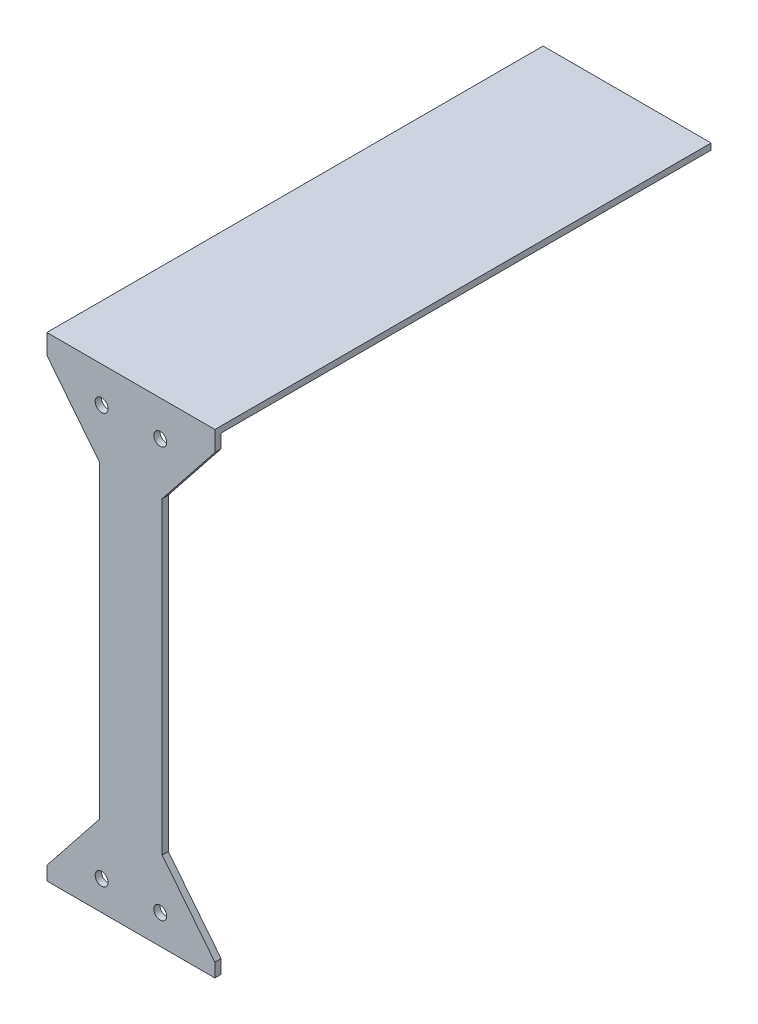
ISO-10303-21;
HEADER;
FILE_DESCRIPTION(('STEP AP214'),'2;1');
FILE_NAME('part.step','',(''),(''),'','','');
FILE_SCHEMA(('AUTOMOTIVE_DESIGN { 1 0 10303 214 1 1 1 1 }'));
ENDSEC;
DATA;
#1=APPLICATION_CONTEXT('core data for automotive mechanical design processes');
#2=APPLICATION_PROTOCOL_DEFINITION('international standard','automotive_design',2000,#1);
#3=PRODUCT_CONTEXT('',#1,'mechanical');
#4=PRODUCT('Part','Part','',(#3));
#5=PRODUCT_RELATED_PRODUCT_CATEGORY('part','',(#4));
#6=PRODUCT_DEFINITION_FORMATION('','',#4);
#7=PRODUCT_DEFINITION_CONTEXT('part definition',#1,'design');
#8=PRODUCT_DEFINITION('design','',#6,#7);
#9=PRODUCT_DEFINITION_SHAPE('','',#8);
#10=(LENGTH_UNIT() NAMED_UNIT(*) SI_UNIT(.MILLI.,.METRE.));
#11=(NAMED_UNIT(*) PLANE_ANGLE_UNIT() SI_UNIT($,.RADIAN.));
#12=(NAMED_UNIT(*) SI_UNIT($,.STERADIAN.) SOLID_ANGLE_UNIT());
#13=UNCERTAINTY_MEASURE_WITH_UNIT(LENGTH_MEASURE(1.E-05),#10,'distance_accuracy_value','');
#14=(GEOMETRIC_REPRESENTATION_CONTEXT(3) GLOBAL_UNCERTAINTY_ASSIGNED_CONTEXT((#13)) GLOBAL_UNIT_ASSIGNED_CONTEXT((#10,
#11,#12)) REPRESENTATION_CONTEXT('',''));
#15=CARTESIAN_POINT('',(0.,0.,0.));
#16=DIRECTION('',(0.,0.,1.));
#17=DIRECTION('',(1.,0.,0.));
#18=AXIS2_PLACEMENT_3D('',#15,#16,#17);
#19=CARTESIAN_POINT('',(0.,0.,1.5875));
#20=DIRECTION('',(0.,0.,-1.));
#21=DIRECTION('',(-1.,0.,0.));
#22=AXIS2_PLACEMENT_3D('',#19,#20,#21);
#23=PLANE('',#22);
#24=DIRECTION('',(0.,1.,0.));
#25=VECTOR('',#24,1.);
#26=CARTESIAN_POINT('',(-117.,20.5,1.5875));
#27=LINE('',#26,#25);
#28=CARTESIAN_POINT('',(-117.,20.5,1.5875));
#29=VERTEX_POINT('',#28);
#30=CARTESIAN_POINT('',(-117.,99.5,1.5875));
#31=VERTEX_POINT('',#30);
#32=EDGE_CURVE('E180',#29,#31,#27,.T.);
#33=ORIENTED_EDGE('',*,*,#32,.T.);
#34=DIRECTION('',(0.621882143601587,0.783110847498294,0.));
#35=VECTOR('',#34,1.);
#36=CARTESIAN_POINT('',(-117.,99.5,1.5875));
#37=LINE('',#36,#35);
#38=CARTESIAN_POINT('',(-103.5,116.5,1.5875));
#39=VERTEX_POINT('',#38);
#40=EDGE_CURVE('E111',#31,#39,#37,.T.);
#41=ORIENTED_EDGE('',*,*,#40,.T.);
#42=DIRECTION('',(0.,1.,0.));
#43=VECTOR('',#42,1.);
#44=CARTESIAN_POINT('',(-103.5,116.5,1.5875));
#45=LINE('',#44,#43);
#46=CARTESIAN_POINT('',(-103.5,121.5875,1.5875));
#47=VERTEX_POINT('',#46);
#48=EDGE_CURVE('E204',#39,#47,#45,.T.);
#49=ORIENTED_EDGE('',*,*,#48,.T.);
#50=DIRECTION('',(1.,0.,0.));
#51=VECTOR('',#50,1.);
#52=CARTESIAN_POINT('',(-146.5,121.5875,1.5875));
#53=LINE('',#52,#51);
#54=CARTESIAN_POINT('',(-146.5,121.5875,1.5875));
#55=VERTEX_POINT('',#54);
#56=EDGE_CURVE('E231',#55,#47,#53,.T.);
#57=ORIENTED_EDGE('',*,*,#56,.F.);
#58=DIRECTION('',(0.,-1.,0.));
#59=VECTOR('',#58,1.);
#60=CARTESIAN_POINT('',(-146.5,116.5,1.5875));
#61=LINE('',#60,#59);
#62=CARTESIAN_POINT('',(-146.5,116.5,1.5875));
#63=VERTEX_POINT('',#62);
#64=EDGE_CURVE('E263',#55,#63,#61,.T.);
#65=ORIENTED_EDGE('',*,*,#64,.T.);
#66=DIRECTION('',(0.621882143601586,-0.783110847498294,0.));
#67=VECTOR('',#66,1.);
#68=CARTESIAN_POINT('',(-146.5,116.5,1.5875));
#69=LINE('',#68,#67);
#70=CARTESIAN_POINT('',(-133.,99.5,1.5875));
#71=VERTEX_POINT('',#70);
#72=EDGE_CURVE('E265',#63,#71,#69,.T.);
#73=ORIENTED_EDGE('',*,*,#72,.T.);
#74=DIRECTION('',(0.,-1.,0.));
#75=VECTOR('',#74,1.);
#76=CARTESIAN_POINT('',(-133.,99.5,1.5875));
#77=LINE('',#76,#75);
#78=CARTESIAN_POINT('',(-133.,20.5,1.5875));
#79=VERTEX_POINT('',#78);
#80=EDGE_CURVE('E267',#71,#79,#77,.T.);
#81=ORIENTED_EDGE('',*,*,#80,.T.);
#82=DIRECTION('',(-0.621882143601586,-0.783110847498294,0.));
#83=VECTOR('',#82,1.);
#84=CARTESIAN_POINT('',(-133.,20.5,1.5875));
#85=LINE('',#84,#83);
#86=CARTESIAN_POINT('',(-146.5,3.5,1.5875));
#87=VERTEX_POINT('',#86);
#88=EDGE_CURVE('E269',#79,#87,#85,.T.);
#89=ORIENTED_EDGE('',*,*,#88,.T.);
#90=DIRECTION('',(0.,-1.,0.));
#91=VECTOR('',#90,1.);
#92=CARTESIAN_POINT('',(-146.5,3.5,1.5875));
#93=LINE('',#92,#91);
#94=CARTESIAN_POINT('',(-146.5,0.,1.5875));
#95=VERTEX_POINT('',#94);
#96=EDGE_CURVE('E138',#87,#95,#93,.T.);
#97=ORIENTED_EDGE('',*,*,#96,.T.);
#98=DIRECTION('',(1.,0.,0.));
#99=VECTOR('',#98,1.);
#100=CARTESIAN_POINT('',(-103.5,0.,1.5875));
#101=LINE('',#100,#99);
#102=CARTESIAN_POINT('',(-103.5,0.,1.5875));
#103=VERTEX_POINT('',#102);
#104=EDGE_CURVE('E132',#95,#103,#101,.T.);
#105=ORIENTED_EDGE('',*,*,#104,.T.);
#106=DIRECTION('',(0.,1.,0.));
#107=VECTOR('',#106,1.);
#108=CARTESIAN_POINT('',(-103.5,3.5,1.5875));
#109=LINE('',#108,#107);
#110=CARTESIAN_POINT('',(-103.5,3.5,1.5875));
#111=VERTEX_POINT('',#110);
#112=EDGE_CURVE('E136',#103,#111,#109,.T.);
#113=ORIENTED_EDGE('',*,*,#112,.T.);
#114=DIRECTION('',(-0.621882143601587,0.783110847498294,0.));
#115=VECTOR('',#114,1.);
#116=CARTESIAN_POINT('',(-103.5,3.5,1.5875));
#117=LINE('',#116,#115);
#118=EDGE_CURVE('E58',#111,#29,#117,.T.);
#119=ORIENTED_EDGE('',*,*,#118,.T.);
#120=EDGE_LOOP('',(#33,#41,#49,#57,#65,#73,#81,#89,#97,#105,#113,#119));
#121=FACE_BOUND('',#120,.T.);
#122=CARTESIAN_POINT('',(-132.5,112.5,1.5875));
#123=DIRECTION('',(0.,0.,1.));
#124=DIRECTION('',(1.,0.,0.));
#125=AXIS2_PLACEMENT_3D('',#122,#123,#124);
#126=CIRCLE('',#125,1.65);
#127=CARTESIAN_POINT('',(-130.85,112.5,1.5875));
#128=VERTEX_POINT('',#127);
#129=EDGE_CURVE('E160',#128,#128,#126,.T.);
#130=ORIENTED_EDGE('',*,*,#129,.F.);
#131=EDGE_LOOP('',(#130));
#132=FACE_BOUND('',#131,.T.);
#133=CARTESIAN_POINT('',(-117.5,112.5,1.5875));
#134=DIRECTION('',(0.,0.,1.));
#135=DIRECTION('',(1.,0.,0.));
#136=AXIS2_PLACEMENT_3D('',#133,#134,#135);
#137=CIRCLE('',#136,1.65000000000001);
#138=CARTESIAN_POINT('',(-115.85,112.5,1.5875));
#139=VERTEX_POINT('',#138);
#140=EDGE_CURVE('E250',#139,#139,#137,.T.);
#141=ORIENTED_EDGE('',*,*,#140,.F.);
#142=EDGE_LOOP('',(#141));
#143=FACE_BOUND('',#142,.T.);
#144=CARTESIAN_POINT('',(-117.5,7.5,1.5875));
#145=DIRECTION('',(0.,0.,1.));
#146=DIRECTION('',(1.,0.,0.));
#147=AXIS2_PLACEMENT_3D('',#144,#145,#146);
#148=CIRCLE('',#147,1.65000000000001);
#149=CARTESIAN_POINT('',(-115.85,7.5,1.5875));
#150=VERTEX_POINT('',#149);
#151=EDGE_CURVE('E244',#150,#150,#148,.T.);
#152=ORIENTED_EDGE('',*,*,#151,.F.);
#153=EDGE_LOOP('',(#152));
#154=FACE_BOUND('',#153,.T.);
#155=CARTESIAN_POINT('',(-132.5,7.5,1.5875));
#156=DIRECTION('',(0.,0.,1.));
#157=DIRECTION('',(1.,0.,0.));
#158=AXIS2_PLACEMENT_3D('',#155,#156,#157);
#159=CIRCLE('',#158,1.65);
#160=CARTESIAN_POINT('',(-130.85,7.5,1.5875));
#161=VERTEX_POINT('',#160);
#162=EDGE_CURVE('E238',#161,#161,#159,.T.);
#163=ORIENTED_EDGE('',*,*,#162,.F.);
#164=EDGE_LOOP('',(#163));
#165=FACE_BOUND('',#164,.T.);
#166=ADVANCED_FACE('F41',(#121,#132,#143,#154,#165),#23,.F.);
#167=CARTESIAN_POINT('',(0.,0.,0.));
#168=DIRECTION('',(0.,0.,-1.));
#169=DIRECTION('',(-1.,0.,0.));
#170=AXIS2_PLACEMENT_3D('',#167,#168,#169);
#171=PLANE('',#170);
#172=CARTESIAN_POINT('',(-117.5,7.5,0.));
#173=DIRECTION('',(0.,0.,1.));
#174=DIRECTION('',(1.,0.,0.));
#175=AXIS2_PLACEMENT_3D('',#172,#173,#174);
#176=CIRCLE('',#175,1.65000000000001);
#177=CARTESIAN_POINT('',(-115.85,7.5,0.));
#178=VERTEX_POINT('',#177);
#179=EDGE_CURVE('E241',#178,#178,#176,.T.);
#180=ORIENTED_EDGE('',*,*,#179,.T.);
#181=EDGE_LOOP('',(#180));
#182=FACE_BOUND('',#181,.T.);
#183=CARTESIAN_POINT('',(-132.5,112.5,0.));
#184=DIRECTION('',(0.,0.,1.));
#185=DIRECTION('',(1.,0.,0.));
#186=AXIS2_PLACEMENT_3D('',#183,#184,#185);
#187=CIRCLE('',#186,1.65);
#188=CARTESIAN_POINT('',(-130.85,112.5,0.));
#189=VERTEX_POINT('',#188);
#190=EDGE_CURVE('E253',#189,#189,#187,.T.);
#191=ORIENTED_EDGE('',*,*,#190,.T.);
#192=EDGE_LOOP('',(#191));
#193=FACE_BOUND('',#192,.T.);
#194=DIRECTION('',(0.,1.,0.));
#195=VECTOR('',#194,1.);
#196=CARTESIAN_POINT('',(-117.,20.5,0.));
#197=LINE('',#196,#195);
#198=CARTESIAN_POINT('',(-117.,20.5,0.));
#199=VERTEX_POINT('',#198);
#200=CARTESIAN_POINT('',(-117.,99.5,0.));
#201=VERTEX_POINT('',#200);
#202=EDGE_CURVE('E156',#199,#201,#197,.T.);
#203=ORIENTED_EDGE('',*,*,#202,.F.);
#204=DIRECTION('',(-0.621882143601587,0.783110847498294,0.));
#205=VECTOR('',#204,1.);
#206=CARTESIAN_POINT('',(-103.5,3.5,0.));
#207=LINE('',#206,#205);
#208=CARTESIAN_POINT('',(-103.5,3.5,0.));
#209=VERTEX_POINT('',#208);
#210=EDGE_CURVE('E103',#209,#199,#207,.T.);
#211=ORIENTED_EDGE('',*,*,#210,.F.);
#212=DIRECTION('',(0.,1.,0.));
#213=VECTOR('',#212,1.);
#214=CARTESIAN_POINT('',(-103.5,3.5,0.));
#215=LINE('',#214,#213);
#216=CARTESIAN_POINT('',(-103.5,0.,0.));
#217=VERTEX_POINT('',#216);
#218=EDGE_CURVE('E97',#217,#209,#215,.T.);
#219=ORIENTED_EDGE('',*,*,#218,.F.);
#220=DIRECTION('',(1.,0.,0.));
#221=VECTOR('',#220,1.);
#222=CARTESIAN_POINT('',(-103.5,0.,0.));
#223=LINE('',#222,#221);
#224=CARTESIAN_POINT('',(-146.5,0.,0.));
#225=VERTEX_POINT('',#224);
#226=EDGE_CURVE('E146',#225,#217,#223,.T.);
#227=ORIENTED_EDGE('',*,*,#226,.F.);
#228=DIRECTION('',(0.,-1.,0.));
#229=VECTOR('',#228,1.);
#230=CARTESIAN_POINT('',(-146.5,3.5,0.));
#231=LINE('',#230,#229);
#232=CARTESIAN_POINT('',(-146.5,3.5,0.));
#233=VERTEX_POINT('',#232);
#234=EDGE_CURVE('E175',#233,#225,#231,.T.);
#235=ORIENTED_EDGE('',*,*,#234,.F.);
#236=DIRECTION('',(-0.621882143601586,-0.783110847498294,0.));
#237=VECTOR('',#236,1.);
#238=CARTESIAN_POINT('',(-133.,20.5,0.));
#239=LINE('',#238,#237);
#240=CARTESIAN_POINT('',(-133.,20.5,0.));
#241=VERTEX_POINT('',#240);
#242=EDGE_CURVE('E173',#241,#233,#239,.T.);
#243=ORIENTED_EDGE('',*,*,#242,.F.);
#244=DIRECTION('',(0.,-1.,0.));
#245=VECTOR('',#244,1.);
#246=CARTESIAN_POINT('',(-133.,99.5,0.));
#247=LINE('',#246,#245);
#248=CARTESIAN_POINT('',(-133.,99.5,0.));
#249=VERTEX_POINT('',#248);
#250=EDGE_CURVE('E171',#249,#241,#247,.T.);
#251=ORIENTED_EDGE('',*,*,#250,.F.);
#252=DIRECTION('',(0.621882143601586,-0.783110847498294,0.));
#253=VECTOR('',#252,1.);
#254=CARTESIAN_POINT('',(-146.5,116.5,0.));
#255=LINE('',#254,#253);
#256=CARTESIAN_POINT('',(-146.5,116.5,0.));
#257=VERTEX_POINT('',#256);
#258=EDGE_CURVE('E169',#257,#249,#255,.T.);
#259=ORIENTED_EDGE('',*,*,#258,.F.);
#260=DIRECTION('',(0.,-1.,0.));
#261=VECTOR('',#260,1.);
#262=CARTESIAN_POINT('',(-146.5,116.5,0.));
#263=LINE('',#262,#261);
#264=CARTESIAN_POINT('',(-146.5,120.,0.));
#265=VERTEX_POINT('',#264);
#266=EDGE_CURVE('E167',#265,#257,#263,.T.);
#267=ORIENTED_EDGE('',*,*,#266,.F.);
#268=DIRECTION('',(-1.,0.,0.));
#269=VECTOR('',#268,1.);
#270=CARTESIAN_POINT('',(-146.5,120.,0.));
#271=LINE('',#270,#269);
#272=CARTESIAN_POINT('',(-103.5,120.,0.));
#273=VERTEX_POINT('',#272);
#274=EDGE_CURVE('E164',#273,#265,#271,.T.);
#275=ORIENTED_EDGE('',*,*,#274,.F.);
#276=DIRECTION('',(0.,1.,0.));
#277=VECTOR('',#276,1.);
#278=CARTESIAN_POINT('',(-103.5,116.5,0.));
#279=LINE('',#278,#277);
#280=CARTESIAN_POINT('',(-103.5,116.5,0.));
#281=VERTEX_POINT('',#280);
#282=EDGE_CURVE('E162',#281,#273,#279,.T.);
#283=ORIENTED_EDGE('',*,*,#282,.F.);
#284=DIRECTION('',(0.621882143601587,0.783110847498294,0.));
#285=VECTOR('',#284,1.);
#286=CARTESIAN_POINT('',(-117.,99.5,0.));
#287=LINE('',#286,#285);
#288=EDGE_CURVE('E159',#201,#281,#287,.T.);
#289=ORIENTED_EDGE('',*,*,#288,.F.);
#290=EDGE_LOOP('',(#203,#211,#219,#227,#235,#243,#251,#259,#267,#275,#283,#289));
#291=FACE_BOUND('',#290,.T.);
#292=CARTESIAN_POINT('',(-117.5,112.5,0.));
#293=DIRECTION('',(0.,0.,1.));
#294=DIRECTION('',(1.,0.,0.));
#295=AXIS2_PLACEMENT_3D('',#292,#293,#294);
#296=CIRCLE('',#295,1.65000000000001);
#297=CARTESIAN_POINT('',(-115.85,112.5,0.));
#298=VERTEX_POINT('',#297);
#299=EDGE_CURVE('E247',#298,#298,#296,.T.);
#300=ORIENTED_EDGE('',*,*,#299,.T.);
#301=EDGE_LOOP('',(#300));
#302=FACE_BOUND('',#301,.T.);
#303=CARTESIAN_POINT('',(-132.5,7.5,0.));
#304=DIRECTION('',(0.,0.,1.));
#305=DIRECTION('',(1.,0.,0.));
#306=AXIS2_PLACEMENT_3D('',#303,#304,#305);
#307=CIRCLE('',#306,1.65);
#308=CARTESIAN_POINT('',(-130.85,7.5,0.));
#309=VERTEX_POINT('',#308);
#310=EDGE_CURVE('E237',#309,#309,#307,.T.);
#311=ORIENTED_EDGE('',*,*,#310,.T.);
#312=EDGE_LOOP('',(#311));
#313=FACE_BOUND('',#312,.T.);
#314=ADVANCED_FACE('F207',(#182,#193,#291,#302,#313),#171,.T.);
#315=CARTESIAN_POINT('',(-117.,20.5,1.5875));
#316=DIRECTION('',(-1.,0.,0.));
#317=DIRECTION('',(0.,0.,1.));
#318=AXIS2_PLACEMENT_3D('',#315,#316,#317);
#319=PLANE('',#318);
#320=ORIENTED_EDGE('',*,*,#202,.T.);
#321=DIRECTION('',(0.,0.,-1.));
#322=VECTOR('',#321,1.);
#323=CARTESIAN_POINT('',(-117.,99.5,1.5875));
#324=LINE('',#323,#322);
#325=EDGE_CURVE('E11',#31,#201,#324,.T.);
#326=ORIENTED_EDGE('',*,*,#325,.F.);
#327=ORIENTED_EDGE('',*,*,#32,.F.);
#328=DIRECTION('',(0.,0.,-1.));
#329=VECTOR('',#328,1.);
#330=CARTESIAN_POINT('',(-117.,20.5,1.5875));
#331=LINE('',#330,#329);
#332=EDGE_CURVE('E152',#29,#199,#331,.T.);
#333=ORIENTED_EDGE('',*,*,#332,.T.);
#334=EDGE_LOOP('',(#320,#326,#327,#333));
#335=FACE_BOUND('',#334,.T.);
#336=ADVANCED_FACE('F43',(#335),#319,.F.);
#337=CARTESIAN_POINT('',(-117.,99.5,1.5875));
#338=DIRECTION('',(-0.783110847498294,0.621882143601587,0.));
#339=DIRECTION('',(-0.621882143601587,-0.783110847498294,0.));
#340=AXIS2_PLACEMENT_3D('',#337,#338,#339);
#341=PLANE('',#340);
#342=ORIENTED_EDGE('',*,*,#288,.T.);
#343=DIRECTION('',(0.,0.,-1.));
#344=VECTOR('',#343,1.);
#345=CARTESIAN_POINT('',(-103.5,116.5,1.5875));
#346=LINE('',#345,#344);
#347=EDGE_CURVE('E50',#39,#281,#346,.T.);
#348=ORIENTED_EDGE('',*,*,#347,.F.);
#349=ORIENTED_EDGE('',*,*,#40,.F.);
#350=ORIENTED_EDGE('',*,*,#325,.T.);
#351=EDGE_LOOP('',(#342,#348,#349,#350));
#352=FACE_BOUND('',#351,.T.);
#353=ADVANCED_FACE('F369',(#352),#341,.F.);
#354=CARTESIAN_POINT('',(-103.5,116.5,1.5875));
#355=DIRECTION('',(-1.,0.,0.));
#356=DIRECTION('',(0.,-1.,0.));
#357=AXIS2_PLACEMENT_3D('',#354,#355,#356);
#358=PLANE('',#357);
#359=ORIENTED_EDGE('',*,*,#282,.T.);
#360=DIRECTION('',(0.,0.,-1.));
#361=VECTOR('',#360,1.);
#362=CARTESIAN_POINT('',(-103.5,120.,1.5875));
#363=LINE('',#362,#361);
#364=CARTESIAN_POINT('',(-103.5,120.,-125.4125));
#365=VERTEX_POINT('',#364);
#366=EDGE_CURVE('E216',#273,#365,#363,.T.);
#367=ORIENTED_EDGE('',*,*,#366,.T.);
#368=DIRECTION('',(0.,-1.,0.));
#369=VECTOR('',#368,1.);
#370=CARTESIAN_POINT('',(-103.5,121.5875,-125.4125));
#371=LINE('',#370,#369);
#372=CARTESIAN_POINT('',(-103.5,121.5875,-125.4125));
#373=VERTEX_POINT('',#372);
#374=EDGE_CURVE('E235',#373,#365,#371,.T.);
#375=ORIENTED_EDGE('',*,*,#374,.F.);
#376=DIRECTION('',(0.,0.,-1.));
#377=VECTOR('',#376,1.);
#378=CARTESIAN_POINT('',(-103.5,121.5875,1.5875));
#379=LINE('',#378,#377);
#380=EDGE_CURVE('E332',#47,#373,#379,.T.);
#381=ORIENTED_EDGE('',*,*,#380,.F.);
#382=ORIENTED_EDGE('',*,*,#48,.F.);
#383=ORIENTED_EDGE('',*,*,#347,.T.);
#384=EDGE_LOOP('',(#359,#367,#375,#381,#382,#383));
#385=FACE_BOUND('',#384,.T.);
#386=ADVANCED_FACE('F199',(#385),#358,.F.);
#387=CARTESIAN_POINT('',(-146.5,116.5,1.5875));
#388=DIRECTION('',(1.,0.,0.));
#389=DIRECTION('',(0.,0.,-1.));
#390=AXIS2_PLACEMENT_3D('',#387,#388,#389);
#391=PLANE('',#390);
#392=ORIENTED_EDGE('',*,*,#266,.T.);
#393=DIRECTION('',(0.,0.,-1.));
#394=VECTOR('',#393,1.);
#395=CARTESIAN_POINT('',(-146.5,116.5,1.5875));
#396=LINE('',#395,#394);
#397=EDGE_CURVE('E193',#63,#257,#396,.T.);
#398=ORIENTED_EDGE('',*,*,#397,.F.);
#399=ORIENTED_EDGE('',*,*,#64,.F.);
#400=DIRECTION('',(0.,0.,1.));
#401=VECTOR('',#400,1.);
#402=CARTESIAN_POINT('',(-146.5,121.5875,-125.4125));
#403=LINE('',#402,#401);
#404=CARTESIAN_POINT('',(-146.5,121.5875,-125.4125));
#405=VERTEX_POINT('',#404);
#406=EDGE_CURVE('E227',#405,#55,#403,.T.);
#407=ORIENTED_EDGE('',*,*,#406,.F.);
#408=DIRECTION('',(0.,-1.,0.));
#409=VECTOR('',#408,1.);
#410=CARTESIAN_POINT('',(-146.5,121.5875,-125.4125));
#411=LINE('',#410,#409);
#412=CARTESIAN_POINT('',(-146.5,120.,-125.4125));
#413=VERTEX_POINT('',#412);
#414=EDGE_CURVE('E232',#405,#413,#411,.T.);
#415=ORIENTED_EDGE('',*,*,#414,.T.);
#416=DIRECTION('',(0.,0.,1.));
#417=VECTOR('',#416,1.);
#418=CARTESIAN_POINT('',(-146.5,120.,-125.4125));
#419=LINE('',#418,#417);
#420=EDGE_CURVE('E224',#413,#265,#419,.T.);
#421=ORIENTED_EDGE('',*,*,#420,.T.);
#422=EDGE_LOOP('',(#392,#398,#399,#407,#415,#421));
#423=FACE_BOUND('',#422,.T.);
#424=ADVANCED_FACE('F346',(#423),#391,.F.);
#425=CARTESIAN_POINT('',(-146.5,116.5,1.5875));
#426=DIRECTION('',(0.783110847498294,0.621882143601586,0.));
#427=DIRECTION('',(-0.621882143601586,0.783110847498294,0.));
#428=AXIS2_PLACEMENT_3D('',#425,#426,#427);
#429=PLANE('',#428);
#430=ORIENTED_EDGE('',*,*,#258,.T.);
#431=DIRECTION('',(0.,0.,-1.));
#432=VECTOR('',#431,1.);
#433=CARTESIAN_POINT('',(-133.,99.5,1.5875));
#434=LINE('',#433,#432);
#435=EDGE_CURVE('E190',#71,#249,#434,.T.);
#436=ORIENTED_EDGE('',*,*,#435,.F.);
#437=ORIENTED_EDGE('',*,*,#72,.F.);
#438=ORIENTED_EDGE('',*,*,#397,.T.);
#439=EDGE_LOOP('',(#430,#436,#437,#438));
#440=FACE_BOUND('',#439,.T.);
#441=ADVANCED_FACE('F352',(#440),#429,.F.);
#442=CARTESIAN_POINT('',(-133.,99.5,1.5875));
#443=DIRECTION('',(1.,0.,0.));
#444=DIRECTION('',(0.,0.,-1.));
#445=AXIS2_PLACEMENT_3D('',#442,#443,#444);
#446=PLANE('',#445);
#447=ORIENTED_EDGE('',*,*,#250,.T.);
#448=DIRECTION('',(0.,0.,-1.));
#449=VECTOR('',#448,1.);
#450=CARTESIAN_POINT('',(-133.,20.5,1.5875));
#451=LINE('',#450,#449);
#452=EDGE_CURVE('E187',#79,#241,#451,.T.);
#453=ORIENTED_EDGE('',*,*,#452,.F.);
#454=ORIENTED_EDGE('',*,*,#80,.F.);
#455=ORIENTED_EDGE('',*,*,#435,.T.);
#456=EDGE_LOOP('',(#447,#453,#454,#455));
#457=FACE_BOUND('',#456,.T.);
#458=ADVANCED_FACE('F355',(#457),#446,.F.);
#459=CARTESIAN_POINT('',(-133.,20.5,1.5875));
#460=DIRECTION('',(0.783110847498294,-0.621882143601586,0.));
#461=DIRECTION('',(0.621882143601586,0.783110847498294,0.));
#462=AXIS2_PLACEMENT_3D('',#459,#460,#461);
#463=PLANE('',#462);
#464=ORIENTED_EDGE('',*,*,#242,.T.);
#465=DIRECTION('',(0.,0.,-1.));
#466=VECTOR('',#465,1.);
#467=CARTESIAN_POINT('',(-146.5,3.5,1.5875));
#468=LINE('',#467,#466);
#469=EDGE_CURVE('E184',#87,#233,#468,.T.);
#470=ORIENTED_EDGE('',*,*,#469,.F.);
#471=ORIENTED_EDGE('',*,*,#88,.F.);
#472=ORIENTED_EDGE('',*,*,#452,.T.);
#473=EDGE_LOOP('',(#464,#470,#471,#472));
#474=FACE_BOUND('',#473,.T.);
#475=ADVANCED_FACE('F275',(#474),#463,.F.);
#476=CARTESIAN_POINT('',(-146.5,3.5,1.5875));
#477=DIRECTION('',(1.,0.,0.));
#478=DIRECTION('',(0.,0.,-1.));
#479=AXIS2_PLACEMENT_3D('',#476,#477,#478);
#480=PLANE('',#479);
#481=ORIENTED_EDGE('',*,*,#234,.T.);
#482=DIRECTION('',(0.,0.,-1.));
#483=VECTOR('',#482,1.);
#484=CARTESIAN_POINT('',(-146.5,0.,1.5875));
#485=LINE('',#484,#483);
#486=EDGE_CURVE('E147',#95,#225,#485,.T.);
#487=ORIENTED_EDGE('',*,*,#486,.F.);
#488=ORIENTED_EDGE('',*,*,#96,.F.);
#489=ORIENTED_EDGE('',*,*,#469,.T.);
#490=EDGE_LOOP('',(#481,#487,#488,#489));
#491=FACE_BOUND('',#490,.T.);
#492=ADVANCED_FACE('F279',(#491),#480,.F.);
#493=CARTESIAN_POINT('',(-103.5,0.,1.5875));
#494=DIRECTION('',(0.,1.,0.));
#495=DIRECTION('',(0.,0.,1.));
#496=AXIS2_PLACEMENT_3D('',#493,#494,#495);
#497=PLANE('',#496);
#498=ORIENTED_EDGE('',*,*,#226,.T.);
#499=DIRECTION('',(0.,0.,-1.));
#500=VECTOR('',#499,1.);
#501=CARTESIAN_POINT('',(-103.5,0.,1.5875));
#502=LINE('',#501,#500);
#503=EDGE_CURVE('E143',#103,#217,#502,.T.);
#504=ORIENTED_EDGE('',*,*,#503,.F.);
#505=ORIENTED_EDGE('',*,*,#104,.F.);
#506=ORIENTED_EDGE('',*,*,#486,.T.);
#507=EDGE_LOOP('',(#498,#504,#505,#506));
#508=FACE_BOUND('',#507,.T.);
#509=ADVANCED_FACE('F144',(#508),#497,.F.);
#510=CARTESIAN_POINT('',(-103.5,3.5,1.5875));
#511=DIRECTION('',(-1.,0.,0.));
#512=DIRECTION('',(0.,0.,1.));
#513=AXIS2_PLACEMENT_3D('',#510,#511,#512);
#514=PLANE('',#513);
#515=ORIENTED_EDGE('',*,*,#218,.T.);
#516=DIRECTION('',(0.,0.,-1.));
#517=VECTOR('',#516,1.);
#518=CARTESIAN_POINT('',(-103.5,3.5,1.5875));
#519=LINE('',#518,#517);
#520=EDGE_CURVE('E148',#111,#209,#519,.T.);
#521=ORIENTED_EDGE('',*,*,#520,.F.);
#522=ORIENTED_EDGE('',*,*,#112,.F.);
#523=ORIENTED_EDGE('',*,*,#503,.T.);
#524=EDGE_LOOP('',(#515,#521,#522,#523));
#525=FACE_BOUND('',#524,.T.);
#526=ADVANCED_FACE('F150',(#525),#514,.F.);
#527=CARTESIAN_POINT('',(-103.5,3.5,1.5875));
#528=DIRECTION('',(-0.783110847498294,-0.621882143601587,0.));
#529=DIRECTION('',(0.621882143601587,-0.783110847498294,0.));
#530=AXIS2_PLACEMENT_3D('',#527,#528,#529);
#531=PLANE('',#530);
#532=ORIENTED_EDGE('',*,*,#210,.T.);
#533=ORIENTED_EDGE('',*,*,#332,.F.);
#534=ORIENTED_EDGE('',*,*,#118,.F.);
#535=ORIENTED_EDGE('',*,*,#520,.T.);
#536=EDGE_LOOP('',(#532,#533,#534,#535));
#537=FACE_BOUND('',#536,.T.);
#538=ADVANCED_FACE('F283',(#537),#531,.F.);
#539=CARTESIAN_POINT('',(-132.5,112.5,1.5875));
#540=DIRECTION('',(0.,0.,-1.));
#541=DIRECTION('',(-1.,0.,0.));
#542=AXIS2_PLACEMENT_3D('',#539,#540,#541);
#543=CYLINDRICAL_SURFACE('',#542,1.65);
#544=ORIENTED_EDGE('',*,*,#190,.F.);
#545=EDGE_LOOP('',(#544));
#546=FACE_BOUND('',#545,.T.);
#547=ORIENTED_EDGE('',*,*,#129,.T.);
#548=EDGE_LOOP('',(#547));
#549=FACE_BOUND('',#548,.T.);
#550=ADVANCED_FACE('F285',(#546,#549),#543,.F.);
#551=CARTESIAN_POINT('',(-117.5,112.5,1.5875));
#552=DIRECTION('',(0.,0.,-1.));
#553=DIRECTION('',(-1.,0.,0.));
#554=AXIS2_PLACEMENT_3D('',#551,#552,#553);
#555=CYLINDRICAL_SURFACE('',#554,1.65000000000001);
#556=ORIENTED_EDGE('',*,*,#299,.F.);
#557=EDGE_LOOP('',(#556));
#558=FACE_BOUND('',#557,.T.);
#559=ORIENTED_EDGE('',*,*,#140,.T.);
#560=EDGE_LOOP('',(#559));
#561=FACE_BOUND('',#560,.T.);
#562=ADVANCED_FACE('F291',(#558,#561),#555,.F.);
#563=CARTESIAN_POINT('',(-117.5,7.5,1.5875));
#564=DIRECTION('',(0.,0.,-1.));
#565=DIRECTION('',(-1.,0.,0.));
#566=AXIS2_PLACEMENT_3D('',#563,#564,#565);
#567=CYLINDRICAL_SURFACE('',#566,1.65000000000001);
#568=ORIENTED_EDGE('',*,*,#179,.F.);
#569=EDGE_LOOP('',(#568));
#570=FACE_BOUND('',#569,.T.);
#571=ORIENTED_EDGE('',*,*,#151,.T.);
#572=EDGE_LOOP('',(#571));
#573=FACE_BOUND('',#572,.T.);
#574=ADVANCED_FACE('F306',(#570,#573),#567,.F.);
#575=CARTESIAN_POINT('',(-132.5,7.5,1.5875));
#576=DIRECTION('',(0.,0.,-1.));
#577=DIRECTION('',(-1.,0.,0.));
#578=AXIS2_PLACEMENT_3D('',#575,#576,#577);
#579=CYLINDRICAL_SURFACE('',#578,1.65);
#580=ORIENTED_EDGE('',*,*,#310,.F.);
#581=EDGE_LOOP('',(#580));
#582=FACE_BOUND('',#581,.T.);
#583=ORIENTED_EDGE('',*,*,#162,.T.);
#584=EDGE_LOOP('',(#583));
#585=FACE_BOUND('',#584,.T.);
#586=ADVANCED_FACE('F310',(#582,#585),#579,.F.);
#587=CARTESIAN_POINT('',(0.,120.,0.));
#588=DIRECTION('',(0.,1.,0.));
#589=DIRECTION('',(0.,0.,1.));
#590=AXIS2_PLACEMENT_3D('',#587,#588,#589);
#591=PLANE('',#590);
#592=ORIENTED_EDGE('',*,*,#366,.F.);
#593=ORIENTED_EDGE('',*,*,#274,.T.);
#594=ORIENTED_EDGE('',*,*,#420,.F.);
#595=DIRECTION('',(-1.,0.,0.));
#596=VECTOR('',#595,1.);
#597=CARTESIAN_POINT('',(-103.5,120.,-125.4125));
#598=LINE('',#597,#596);
#599=EDGE_CURVE('E220',#365,#413,#598,.T.);
#600=ORIENTED_EDGE('',*,*,#599,.F.);
#601=EDGE_LOOP('',(#592,#593,#594,#600));
#602=FACE_BOUND('',#601,.T.);
#603=ADVANCED_FACE('F217',(#602),#591,.F.);
#604=CARTESIAN_POINT('',(-103.5,121.5875,-125.4125));
#605=DIRECTION('',(0.,0.,1.));
#606=DIRECTION('',(1.,0.,0.));
#607=AXIS2_PLACEMENT_3D('',#604,#605,#606);
#608=PLANE('',#607);
#609=ORIENTED_EDGE('',*,*,#599,.T.);
#610=ORIENTED_EDGE('',*,*,#414,.F.);
#611=DIRECTION('',(-1.,0.,0.));
#612=VECTOR('',#611,1.);
#613=CARTESIAN_POINT('',(-103.5,121.5875,-125.4125));
#614=LINE('',#613,#612);
#615=EDGE_CURVE('E338',#373,#405,#614,.T.);
#616=ORIENTED_EDGE('',*,*,#615,.F.);
#617=ORIENTED_EDGE('',*,*,#374,.T.);
#618=EDGE_LOOP('',(#609,#610,#616,#617));
#619=FACE_BOUND('',#618,.T.);
#620=ADVANCED_FACE('F314',(#619),#608,.F.);
#621=CARTESIAN_POINT('',(0.,121.5875,0.));
#622=DIRECTION('',(0.,1.,0.));
#623=DIRECTION('',(0.,0.,1.));
#624=AXIS2_PLACEMENT_3D('',#621,#622,#623);
#625=PLANE('',#624);
#626=ORIENTED_EDGE('',*,*,#56,.T.);
#627=ORIENTED_EDGE('',*,*,#380,.T.);
#628=ORIENTED_EDGE('',*,*,#615,.T.);
#629=ORIENTED_EDGE('',*,*,#406,.T.);
#630=EDGE_LOOP('',(#626,#627,#628,#629));
#631=FACE_BOUND('',#630,.T.);
#632=ADVANCED_FACE('F317',(#631),#625,.T.);
#633=CLOSED_SHELL('',(#166,#314,#336,#353,#386,#424,#441,#458,#475,#492,#509,#526,#538,#550,
#562,#574,#586,#603,#620,#632));
#634=MANIFOLD_SOLID_BREP('B2',#633);
#635=ADVANCED_BREP_SHAPE_REPRESENTATION('',(#18,#634),#14);
#636=SHAPE_DEFINITION_REPRESENTATION(#9,#635);
ENDSEC;
END-ISO-10303-21;
